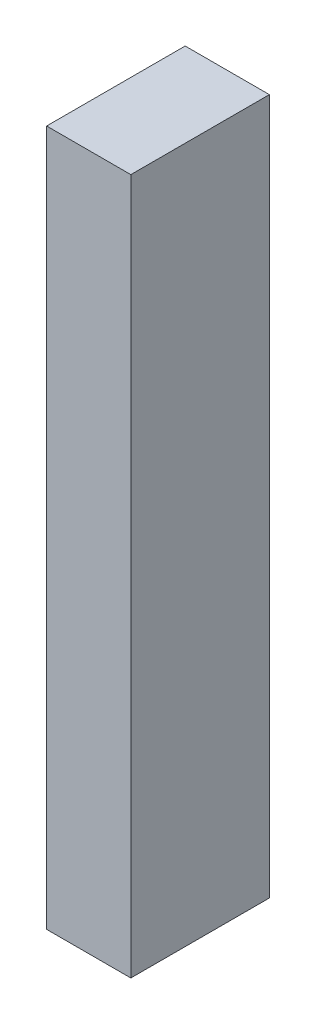
ISO-10303-21;
HEADER;
FILE_DESCRIPTION(('STEP AP214'),'2;1');
FILE_NAME('part.step','',(''),(''),'','','');
FILE_SCHEMA(('AUTOMOTIVE_DESIGN { 1 0 10303 214 1 1 1 1 }'));
ENDSEC;
DATA;
#1=APPLICATION_CONTEXT('core data for automotive mechanical design processes');
#2=APPLICATION_PROTOCOL_DEFINITION('international standard','automotive_design',2000,#1);
#3=PRODUCT_CONTEXT('',#1,'mechanical');
#4=PRODUCT('Part','Part','',(#3));
#5=PRODUCT_RELATED_PRODUCT_CATEGORY('part','',(#4));
#6=PRODUCT_DEFINITION_FORMATION('','',#4);
#7=PRODUCT_DEFINITION_CONTEXT('part definition',#1,'design');
#8=PRODUCT_DEFINITION('design','',#6,#7);
#9=PRODUCT_DEFINITION_SHAPE('','',#8);
#10=(LENGTH_UNIT() NAMED_UNIT(*) SI_UNIT(.MILLI.,.METRE.));
#11=(NAMED_UNIT(*) PLANE_ANGLE_UNIT() SI_UNIT($,.RADIAN.));
#12=(NAMED_UNIT(*) SI_UNIT($,.STERADIAN.) SOLID_ANGLE_UNIT());
#13=UNCERTAINTY_MEASURE_WITH_UNIT(LENGTH_MEASURE(1.E-05),#10,'distance_accuracy_value','');
#14=(GEOMETRIC_REPRESENTATION_CONTEXT(3) GLOBAL_UNCERTAINTY_ASSIGNED_CONTEXT((#13)) GLOBAL_UNIT_ASSIGNED_CONTEXT((#10,
#11,#12)) REPRESENTATION_CONTEXT('',''));
#15=CARTESIAN_POINT('',(0.,0.,0.));
#16=DIRECTION('',(0.,0.,1.));
#17=DIRECTION('',(1.,0.,0.));
#18=AXIS2_PLACEMENT_3D('',#15,#16,#17);
#19=CARTESIAN_POINT('',(-7.937396608578,-8.009055087084,0.));
#20=DIRECTION('',(1.,0.,0.));
#21=DIRECTION('',(0.,1.,0.));
#22=AXIS2_PLACEMENT_3D('',#19,#20,#21);
#23=PLANE('',#22);
#24=DIRECTION('',(0.,-1.,0.));
#25=VECTOR('',#24,1.);
#26=CARTESIAN_POINT('',(-7.937396608578,-7.506899475119,0.));
#27=LINE('',#26,#25);
#28=CARTESIAN_POINT('',(-7.937396608578,-7.506899475119,0.));
#29=VERTEX_POINT('',#28);
#30=CARTESIAN_POINT('',(-7.937396608578,-8.009055087084,0.));
#31=VERTEX_POINT('',#30);
#32=EDGE_CURVE('E11',#29,#31,#27,.T.);
#33=ORIENTED_EDGE('',*,*,#32,.F.);
#34=DIRECTION('',(0.,0.,1.));
#35=VECTOR('',#34,1.);
#36=CARTESIAN_POINT('',(-7.937396608578,-7.506899475119,0.));
#37=LINE('',#36,#35);
#38=CARTESIAN_POINT('',(-7.937396608578,-7.506899475119,0.1));
#39=VERTEX_POINT('',#38);
#40=EDGE_CURVE('E24',#29,#39,#37,.T.);
#41=ORIENTED_EDGE('',*,*,#40,.T.);
#42=DIRECTION('',(0.,1.,0.));
#43=VECTOR('',#42,1.);
#44=CARTESIAN_POINT('',(-7.937396608578,-7.506899475119,0.1));
#45=LINE('',#44,#43);
#46=CARTESIAN_POINT('',(-7.937396608578,-8.009055087084,0.1));
#47=VERTEX_POINT('',#46);
#48=EDGE_CURVE('E75',#47,#39,#45,.T.);
#49=ORIENTED_EDGE('',*,*,#48,.F.);
#50=DIRECTION('',(0.,0.,1.));
#51=VECTOR('',#50,1.);
#52=CARTESIAN_POINT('',(-7.937396608578,-8.009055087084,0.));
#53=LINE('',#52,#51);
#54=EDGE_CURVE('E85',#31,#47,#53,.T.);
#55=ORIENTED_EDGE('',*,*,#54,.F.);
#56=EDGE_LOOP('',(#33,#41,#49,#55));
#57=FACE_BOUND('',#56,.T.);
#58=ADVANCED_FACE('F17',(#57),#23,.T.);
#59=CARTESIAN_POINT('',(-7.998169514293,-8.009055087084,0.));
#60=DIRECTION('',(0.,-1.,0.));
#61=DIRECTION('',(1.,0.,0.));
#62=AXIS2_PLACEMENT_3D('',#59,#60,#61);
#63=PLANE('',#62);
#64=DIRECTION('',(-1.,0.,0.));
#65=VECTOR('',#64,1.);
#66=CARTESIAN_POINT('',(-7.937396608578,-8.009055087084,0.));
#67=LINE('',#66,#65);
#68=CARTESIAN_POINT('',(-7.998169514293,-8.009055087084,0.));
#69=VERTEX_POINT('',#68);
#70=EDGE_CURVE('E83',#31,#69,#67,.T.);
#71=ORIENTED_EDGE('',*,*,#70,.F.);
#72=ORIENTED_EDGE('',*,*,#54,.T.);
#73=DIRECTION('',(1.,0.,0.));
#74=VECTOR('',#73,1.);
#75=CARTESIAN_POINT('',(-7.937396608578,-8.009055087084,0.1));
#76=LINE('',#75,#74);
#77=CARTESIAN_POINT('',(-7.998169514293,-8.009055087084,0.1));
#78=VERTEX_POINT('',#77);
#79=EDGE_CURVE('E81',#78,#47,#76,.T.);
#80=ORIENTED_EDGE('',*,*,#79,.F.);
#81=DIRECTION('',(0.,0.,1.));
#82=VECTOR('',#81,1.);
#83=CARTESIAN_POINT('',(-7.998169514293,-8.009055087084,0.));
#84=LINE('',#83,#82);
#85=EDGE_CURVE('E61',#69,#78,#84,.T.);
#86=ORIENTED_EDGE('',*,*,#85,.F.);
#87=EDGE_LOOP('',(#71,#72,#80,#86));
#88=FACE_BOUND('',#87,.T.);
#89=ADVANCED_FACE('F91',(#88),#63,.T.);
#90=CARTESIAN_POINT('',(-7.998169514293,-7.506899475119,0.));
#91=DIRECTION('',(-1.,0.,0.));
#92=DIRECTION('',(0.,-1.,0.));
#93=AXIS2_PLACEMENT_3D('',#90,#91,#92);
#94=PLANE('',#93);
#95=DIRECTION('',(0.,1.,0.));
#96=VECTOR('',#95,1.);
#97=CARTESIAN_POINT('',(-7.998169514293,-8.009055087084,0.));
#98=LINE('',#97,#96);
#99=CARTESIAN_POINT('',(-7.998169514293,-7.506899475119,0.));
#100=VERTEX_POINT('',#99);
#101=EDGE_CURVE('E65',#69,#100,#98,.T.);
#102=ORIENTED_EDGE('',*,*,#101,.F.);
#103=ORIENTED_EDGE('',*,*,#85,.T.);
#104=DIRECTION('',(0.,-1.,0.));
#105=VECTOR('',#104,1.);
#106=CARTESIAN_POINT('',(-7.998169514293,-8.009055087084,0.1));
#107=LINE('',#106,#105);
#108=CARTESIAN_POINT('',(-7.998169514293,-7.506899475119,0.1));
#109=VERTEX_POINT('',#108);
#110=EDGE_CURVE('E54',#109,#78,#107,.T.);
#111=ORIENTED_EDGE('',*,*,#110,.F.);
#112=DIRECTION('',(0.,0.,1.));
#113=VECTOR('',#112,1.);
#114=CARTESIAN_POINT('',(-7.998169514293,-7.506899475119,0.));
#115=LINE('',#114,#113);
#116=EDGE_CURVE('E58',#100,#109,#115,.T.);
#117=ORIENTED_EDGE('',*,*,#116,.F.);
#118=EDGE_LOOP('',(#102,#103,#111,#117));
#119=FACE_BOUND('',#118,.T.);
#120=ADVANCED_FACE('F57',(#119),#94,.T.);
#121=CARTESIAN_POINT('',(-7.937396608578,-7.506899475119,0.));
#122=DIRECTION('',(0.,1.,0.));
#123=DIRECTION('',(-1.,0.,0.));
#124=AXIS2_PLACEMENT_3D('',#121,#122,#123);
#125=PLANE('',#124);
#126=DIRECTION('',(1.,0.,0.));
#127=VECTOR('',#126,1.);
#128=CARTESIAN_POINT('',(-7.998169514293,-7.506899475119,0.));
#129=LINE('',#128,#127);
#130=EDGE_CURVE('E71',#100,#29,#129,.T.);
#131=ORIENTED_EDGE('',*,*,#130,.F.);
#132=ORIENTED_EDGE('',*,*,#116,.T.);
#133=DIRECTION('',(-1.,0.,0.));
#134=VECTOR('',#133,1.);
#135=CARTESIAN_POINT('',(-7.998169514293,-7.506899475119,0.1));
#136=LINE('',#135,#134);
#137=EDGE_CURVE('E70',#39,#109,#136,.T.);
#138=ORIENTED_EDGE('',*,*,#137,.F.);
#139=ORIENTED_EDGE('',*,*,#40,.F.);
#140=EDGE_LOOP('',(#131,#132,#138,#139));
#141=FACE_BOUND('',#140,.T.);
#142=ADVANCED_FACE('F69',(#141),#125,.T.);
#143=CARTESIAN_POINT('',(-7.967783061435,-7.757977281102,0.));
#144=DIRECTION('',(0.,0.,1.));
#145=DIRECTION('',(1.,0.,0.));
#146=AXIS2_PLACEMENT_3D('',#143,#144,#145);
#147=PLANE('',#146);
#148=ORIENTED_EDGE('',*,*,#130,.T.);
#149=ORIENTED_EDGE('',*,*,#32,.T.);
#150=ORIENTED_EDGE('',*,*,#70,.T.);
#151=ORIENTED_EDGE('',*,*,#101,.T.);
#152=EDGE_LOOP('',(#148,#149,#150,#151));
#153=FACE_BOUND('',#152,.T.);
#154=ADVANCED_FACE('F88',(#153),#147,.F.);
#155=CARTESIAN_POINT('',(-7.967783061435,-7.757977281102,0.1));
#156=DIRECTION('',(0.,0.,1.));
#157=DIRECTION('',(1.,0.,0.));
#158=AXIS2_PLACEMENT_3D('',#155,#156,#157);
#159=PLANE('',#158);
#160=ORIENTED_EDGE('',*,*,#137,.T.);
#161=ORIENTED_EDGE('',*,*,#110,.T.);
#162=ORIENTED_EDGE('',*,*,#79,.T.);
#163=ORIENTED_EDGE('',*,*,#48,.T.);
#164=EDGE_LOOP('',(#160,#161,#162,#163));
#165=FACE_BOUND('',#164,.T.);
#166=ADVANCED_FACE('F74',(#165),#159,.T.);
#167=CLOSED_SHELL('',(#58,#89,#120,#142,#154,#166));
#168=MANIFOLD_SOLID_BREP('B1',#167);
#169=ADVANCED_BREP_SHAPE_REPRESENTATION('',(#18,#168),#14);
#170=SHAPE_DEFINITION_REPRESENTATION(#9,#169);
ENDSEC;
END-ISO-10303-21;
